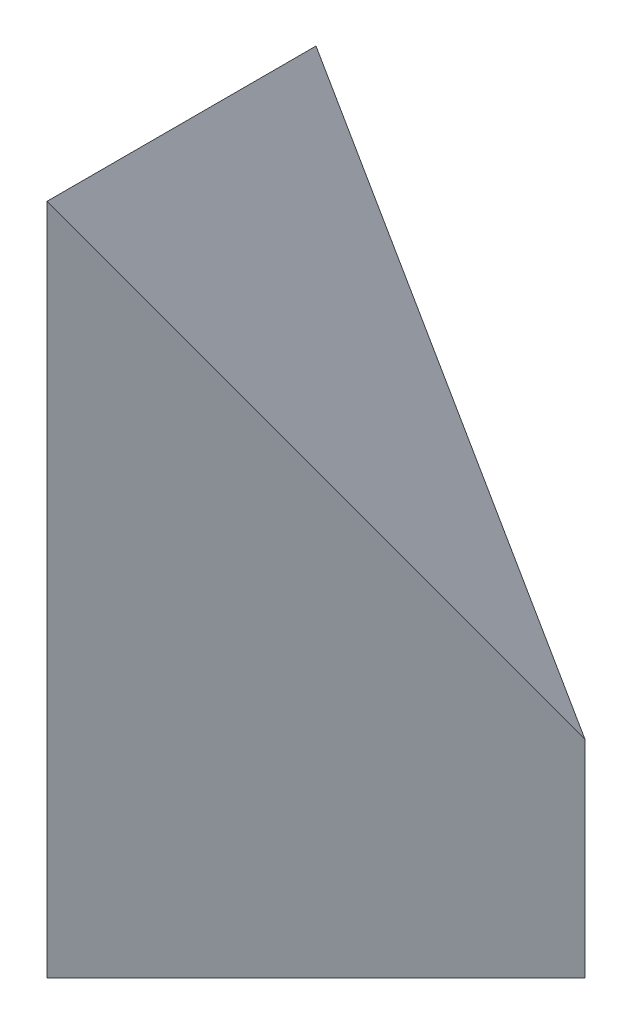
ISO-10303-21;
HEADER;
FILE_DESCRIPTION(('STEP AP214'),'2;1');
FILE_NAME('part.step','',(''),(''),'','','');
FILE_SCHEMA(('AUTOMOTIVE_DESIGN { 1 0 10303 214 1 1 1 1 }'));
ENDSEC;
DATA;
#1=APPLICATION_CONTEXT('core data for automotive mechanical design processes');
#2=APPLICATION_PROTOCOL_DEFINITION('international standard','automotive_design',2000,#1);
#3=PRODUCT_CONTEXT('',#1,'mechanical');
#4=PRODUCT('Part','Part','',(#3));
#5=PRODUCT_RELATED_PRODUCT_CATEGORY('part','',(#4));
#6=PRODUCT_DEFINITION_FORMATION('','',#4);
#7=PRODUCT_DEFINITION_CONTEXT('part definition',#1,'design');
#8=PRODUCT_DEFINITION('design','',#6,#7);
#9=PRODUCT_DEFINITION_SHAPE('','',#8);
#10=(LENGTH_UNIT() NAMED_UNIT(*) SI_UNIT(.MILLI.,.METRE.));
#11=(NAMED_UNIT(*) PLANE_ANGLE_UNIT() SI_UNIT($,.RADIAN.));
#12=(NAMED_UNIT(*) SI_UNIT($,.STERADIAN.) SOLID_ANGLE_UNIT());
#13=UNCERTAINTY_MEASURE_WITH_UNIT(LENGTH_MEASURE(1.E-05),#10,'distance_accuracy_value','');
#14=(GEOMETRIC_REPRESENTATION_CONTEXT(3) GLOBAL_UNCERTAINTY_ASSIGNED_CONTEXT((#13)) GLOBAL_UNIT_ASSIGNED_CONTEXT((#10,
#11,#12)) REPRESENTATION_CONTEXT('',''));
#15=CARTESIAN_POINT('',(0.,0.,0.));
#16=DIRECTION('',(0.,0.,1.));
#17=DIRECTION('',(1.,0.,0.));
#18=AXIS2_PLACEMENT_3D('',#15,#16,#17);
#19=CARTESIAN_POINT('',(0.,127.,-31.75));
#20=DIRECTION('',(0.,0.,1.));
#21=DIRECTION('',(1.,0.,0.));
#22=AXIS2_PLACEMENT_3D('',#19,#20,#21);
#23=PLANE('',#22);
#24=DIRECTION('',(-0.500000000000001,0.866025403784438,0.));
#25=VECTOR('',#24,1.);
#26=CARTESIAN_POINT('',(0.,127.,-31.75));
#27=LINE('',#26,#25);
#28=CARTESIAN_POINT('',(50.8,39.0118189755013,-31.75));
#29=VERTEX_POINT('',#28);
#30=CARTESIAN_POINT('',(0.,127.,-31.75));
#31=VERTEX_POINT('',#30);
#32=EDGE_CURVE('E47',#29,#31,#27,.T.);
#33=ORIENTED_EDGE('',*,*,#32,.F.);
#34=DIRECTION('',(0.,-1.,0.));
#35=VECTOR('',#34,1.);
#36=CARTESIAN_POINT('',(50.8,127.,-31.75));
#37=LINE('',#36,#35);
#38=CARTESIAN_POINT('',(50.8,0.,-31.75));
#39=VERTEX_POINT('',#38);
#40=EDGE_CURVE('E80',#29,#39,#37,.T.);
#41=ORIENTED_EDGE('',*,*,#40,.T.);
#42=DIRECTION('',(-1.,0.,0.));
#43=VECTOR('',#42,1.);
#44=CARTESIAN_POINT('',(0.,0.,-31.75));
#45=LINE('',#44,#43);
#46=CARTESIAN_POINT('',(0.,0.,-31.75));
#47=VERTEX_POINT('',#46);
#48=EDGE_CURVE('E73',#39,#47,#45,.T.);
#49=ORIENTED_EDGE('',*,*,#48,.T.);
#50=DIRECTION('',(0.,-1.,0.));
#51=VECTOR('',#50,1.);
#52=CARTESIAN_POINT('',(0.,127.,-31.75));
#53=LINE('',#52,#51);
#54=EDGE_CURVE('E11',#31,#47,#53,.T.);
#55=ORIENTED_EDGE('',*,*,#54,.F.);
#56=EDGE_LOOP('',(#33,#41,#49,#55));
#57=FACE_BOUND('',#56,.T.);
#58=ADVANCED_FACE('F33',(#57),#23,.F.);
#59=CARTESIAN_POINT('',(0.,127.,19.05));
#60=DIRECTION('',(-0.707106781186548,0.,-0.707106781186548));
#61=DIRECTION('',(-0.707106781186548,0.,0.707106781186548));
#62=AXIS2_PLACEMENT_3D('',#59,#60,#61);
#63=PLANE('',#62);
#64=DIRECTION('',(0.447213595499959,-0.774596669241482,-0.447213595499959));
#65=VECTOR('',#64,1.);
#66=CARTESIAN_POINT('',(0.,127.,19.05));
#67=LINE('',#66,#65);
#68=CARTESIAN_POINT('',(0.,127.,19.05));
#69=VERTEX_POINT('',#68);
#70=EDGE_CURVE('E79',#69,#29,#67,.T.);
#71=ORIENTED_EDGE('',*,*,#70,.F.);
#72=DIRECTION('',(0.,-1.,0.));
#73=VECTOR('',#72,1.);
#74=CARTESIAN_POINT('',(0.,127.,19.05));
#75=LINE('',#74,#73);
#76=CARTESIAN_POINT('',(0.,0.,19.05));
#77=VERTEX_POINT('',#76);
#78=EDGE_CURVE('E40',#69,#77,#75,.T.);
#79=ORIENTED_EDGE('',*,*,#78,.T.);
#80=DIRECTION('',(0.707106781186547,0.,-0.707106781186547));
#81=VECTOR('',#80,1.);
#82=CARTESIAN_POINT('',(0.,0.,19.05));
#83=LINE('',#82,#81);
#84=EDGE_CURVE('E72',#77,#39,#83,.T.);
#85=ORIENTED_EDGE('',*,*,#84,.T.);
#86=ORIENTED_EDGE('',*,*,#40,.F.);
#87=EDGE_LOOP('',(#71,#79,#85,#86));
#88=FACE_BOUND('',#87,.T.);
#89=ADVANCED_FACE('F77',(#88),#63,.F.);
#90=CARTESIAN_POINT('',(0.,127.,-31.75));
#91=DIRECTION('',(1.,0.,0.));
#92=DIRECTION('',(0.,0.,-1.));
#93=AXIS2_PLACEMENT_3D('',#90,#91,#92);
#94=PLANE('',#93);
#95=DIRECTION('',(0.,0.,1.));
#96=VECTOR('',#95,1.);
#97=CARTESIAN_POINT('',(0.,0.,-31.75));
#98=LINE('',#97,#96);
#99=EDGE_CURVE('E64',#47,#77,#98,.T.);
#100=ORIENTED_EDGE('',*,*,#99,.T.);
#101=ORIENTED_EDGE('',*,*,#78,.F.);
#102=DIRECTION('',(0.,0.,1.));
#103=VECTOR('',#102,1.);
#104=CARTESIAN_POINT('',(0.,127.,-31.75));
#105=LINE('',#104,#103);
#106=EDGE_CURVE('E55',#31,#69,#105,.T.);
#107=ORIENTED_EDGE('',*,*,#106,.F.);
#108=ORIENTED_EDGE('',*,*,#54,.T.);
#109=EDGE_LOOP('',(#100,#101,#107,#108));
#110=FACE_BOUND('',#109,.T.);
#111=ADVANCED_FACE('F66',(#110),#94,.F.);
#112=CARTESIAN_POINT('',(0.,0.,0.));
#113=DIRECTION('',(0.,-1.,0.));
#114=DIRECTION('',(0.,0.,-1.));
#115=AXIS2_PLACEMENT_3D('',#112,#113,#114);
#116=PLANE('',#115);
#117=ORIENTED_EDGE('',*,*,#48,.F.);
#118=ORIENTED_EDGE('',*,*,#84,.F.);
#119=ORIENTED_EDGE('',*,*,#99,.F.);
#120=EDGE_LOOP('',(#117,#118,#119));
#121=FACE_BOUND('',#120,.T.);
#122=ADVANCED_FACE('F81',(#121),#116,.T.);
#123=CARTESIAN_POINT('',(0.,127.,222.077364027582));
#124=DIRECTION('',(0.866025403784438,0.500000000000001,0.));
#125=DIRECTION('',(-0.500000000000001,0.866025403784438,0.));
#126=AXIS2_PLACEMENT_3D('',#123,#124,#125);
#127=PLANE('',#126);
#128=ORIENTED_EDGE('',*,*,#70,.T.);
#129=ORIENTED_EDGE('',*,*,#32,.T.);
#130=ORIENTED_EDGE('',*,*,#106,.T.);
#131=EDGE_LOOP('',(#128,#129,#130));
#132=FACE_BOUND('',#131,.T.);
#133=ADVANCED_FACE('F87',(#132),#127,.T.);
#134=CLOSED_SHELL('',(#58,#89,#111,#122,#133));
#135=MANIFOLD_SOLID_BREP('B2',#134);
#136=ADVANCED_BREP_SHAPE_REPRESENTATION('',(#18,#135),#14);
#137=SHAPE_DEFINITION_REPRESENTATION(#9,#136);
ENDSEC;
END-ISO-10303-21;
